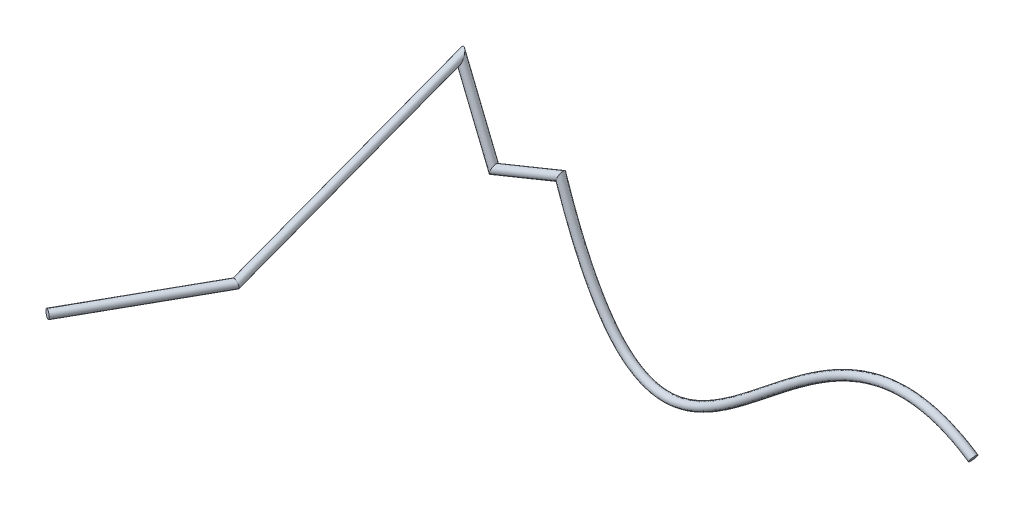
ISO-10303-21;
HEADER;
FILE_DESCRIPTION(('STEP AP214'),'2;1');
FILE_NAME('part.step','',(''),(''),'','','');
FILE_SCHEMA(('AUTOMOTIVE_DESIGN { 1 0 10303 214 1 1 1 1 }'));
ENDSEC;
DATA;
#1=APPLICATION_CONTEXT('core data for automotive mechanical design processes');
#2=APPLICATION_PROTOCOL_DEFINITION('international standard','automotive_design',2000,#1);
#3=PRODUCT_CONTEXT('',#1,'mechanical');
#4=PRODUCT('Part','Part','',(#3));
#5=PRODUCT_RELATED_PRODUCT_CATEGORY('part','',(#4));
#6=PRODUCT_DEFINITION_FORMATION('','',#4);
#7=PRODUCT_DEFINITION_CONTEXT('part definition',#1,'design');
#8=PRODUCT_DEFINITION('design','',#6,#7);
#9=PRODUCT_DEFINITION_SHAPE('','',#8);
#10=(LENGTH_UNIT() NAMED_UNIT(*) SI_UNIT(.MILLI.,.METRE.));
#11=(NAMED_UNIT(*) PLANE_ANGLE_UNIT() SI_UNIT($,.RADIAN.));
#12=(NAMED_UNIT(*) SI_UNIT($,.STERADIAN.) SOLID_ANGLE_UNIT());
#13=UNCERTAINTY_MEASURE_WITH_UNIT(LENGTH_MEASURE(1.E-05),#10,'distance_accuracy_value','');
#14=(GEOMETRIC_REPRESENTATION_CONTEXT(3) GLOBAL_UNCERTAINTY_ASSIGNED_CONTEXT((#13)) GLOBAL_UNIT_ASSIGNED_CONTEXT((#10,
#11,#12)) REPRESENTATION_CONTEXT('',''));
#15=CARTESIAN_POINT('',(0.,0.,0.));
#16=DIRECTION('',(0.,0.,1.));
#17=DIRECTION('',(1.,0.,0.));
#18=AXIS2_PLACEMENT_3D('',#15,#16,#17);
#19=CARTESIAN_POINT('',(497.216779831888,-46.1851285831756,-1.13686837721616E-10));
#20=DIRECTION('',(-0.829798156967304,0.55806363319398,1.88543639242115E-13));
#21=DIRECTION('',(-0.55806363319398,-0.829798156967304,0.));
#22=AXIS2_PLACEMENT_3D('',#19,#20,#21);
#23=PLANE('',#22);
#24=CARTESIAN_POINT('',(497.216779831888,-46.1851285831756,-1.13686837721616E-10));
#25=DIRECTION('',(-0.829798156967304,0.55806363319398,1.88543639242115E-13));
#26=DIRECTION('',(-0.55806363319398,-0.829798156967304,0.));
#27=AXIS2_PLACEMENT_3D('',#24,#25,#26);
#28=CIRCLE('',#27,5.);
#29=CARTESIAN_POINT('',(494.426461665918,-50.3341193680121,-1.13686837721616E-10));
#30=VERTEX_POINT('',#29);
#31=EDGE_CURVE('E54',#30,#30,#28,.T.);
#32=ORIENTED_EDGE('',*,*,#31,.F.);
#33=EDGE_LOOP('',(#32));
#34=FACE_BOUND('',#33,.T.);
#35=ADVANCED_FACE('F51',(#34),#23,.F.);
#36=CARTESIAN_POINT('',(-202.256735264331,-36.9063998138871,416.452245622386));
#37=DIRECTION('',(-0.489709501015613,0.,0.87188566028754));
#38=DIRECTION('',(-0.782575842068746,-0.44087797243746,-0.439547113322142));
#39=AXIS2_PLACEMENT_3D('',#36,#37,#38);
#40=PLANE('',#39);
#41=CARTESIAN_POINT('',(-202.256735264331,-36.9063998138871,416.452245622386));
#42=DIRECTION('',(-0.489709501015613,0.,0.87188566028754));
#43=DIRECTION('',(-0.782575842068746,-0.44087797243746,-0.439547113322142));
#44=AXIS2_PLACEMENT_3D('',#41,#42,#43);
#45=CIRCLE('',#44,5.);
#46=CARTESIAN_POINT('',(-206.169614474675,-39.1107896760744,414.254510055775));
#47=VERTEX_POINT('',#46);
#48=EDGE_CURVE('E59',#47,#47,#45,.T.);
#49=ORIENTED_EDGE('',*,*,#48,.T.);
#50=EDGE_LOOP('',(#49));
#51=FACE_BOUND('',#50,.T.);
#52=ADVANCED_FACE('F103',(#51),#40,.T.);
#53=CARTESIAN_POINT('',(-6.63474122880986,4.0650512970628,-8.80261898284409E-13));
#54=CARTESIAN_POINT('',(-6.0035207391564,2.1806569216738,-6.37784321443613E-13));
#55=CARTESIAN_POINT('',(-5.37388169208276,0.300982080219251,-3.95913953218129E-13));
#56=CARTESIAN_POINT('',(-2.54033983180936,-8.1580365667172,6.9256394216942E-13));
#57=CARTESIAN_POINT('',(-0.328969705829117,-14.5324954036041,1.50050494951648E-12));
#58=CARTESIAN_POINT('',(4.08312919821201,-26.8046610107858,3.03062382439137E-12));
#59=CARTESIAN_POINT('',(6.28935711963189,-32.7187923428632,3.75491557554203E-12));
#60=CARTESIAN_POINT('',(12.9103724025411,-49.8144184352364,5.80820924468679E-12));
#61=CARTESIAN_POINT('',(17.327410592961,-60.3491361879649,7.01764095717164E-12));
#62=CARTESIAN_POINT('',(30.6043976298377,-89.5193964643671,1.01891184635107E-11));
#63=CARTESIAN_POINT('',(39.4880050848905,-105.722114577973,1.16948999032293E-11));
#64=CARTESIAN_POINT('',(57.4502543438682,-132.448194600693,1.35958017822525E-11));
#65=CARTESIAN_POINT('',(66.5315598473905,-142.977430395832,1.39915655149074E-11));
#66=CARTESIAN_POINT('',(85.0724108261196,-159.068797156933,1.37526507977899E-11));
#67=CARTESIAN_POINT('',(94.5491713236075,-164.62554381891,1.31142048198872E-11));
#68=CARTESIAN_POINT('',(113.834005288215,-171.262487594358,1.08837615934277E-11));
#69=CARTESIAN_POINT('',(123.616351955995,-172.323346833214,9.29238797402864E-12));
#70=CARTESIAN_POINT('',(143.11619774965,-170.777656736841,5.34768741321133E-12));
#71=CARTESIAN_POINT('',(152.831916525129,-168.194028030498,2.99883889543333E-12));
#72=CARTESIAN_POINT('',(181.936513959763,-156.509771788991,-4.94342656092221E-12));
#73=CARTESIAN_POINT('',(201.347233479159,-143.50008080194,-1.14385307465792E-11));
#74=CARTESIAN_POINT('',(241.158752519339,-113.538596838648,-2.59618388880978E-11));
#75=CARTESIAN_POINT('',(261.546287493366,-96.5582198062982,-3.39931244441428E-11));
#76=CARTESIAN_POINT('',(303.699242799623,-64.85447344232,-5.0681176746404E-11));
#77=CARTESIAN_POINT('',(325.459824610901,-50.1425259263933,-5.93350730027813E-11));
#78=CARTESIAN_POINT('',(359.222014105486,-34.4010459149647,-7.20743644230787E-11));
#79=CARTESIAN_POINT('',(370.65948906735,-30.2059742037353,-7.62803982912943E-11));
#80=CARTESIAN_POINT('',(393.935607225174,-24.6356125891442,-8.45067748175605E-11));
#81=CARTESIAN_POINT('',(405.772194632465,-23.2571386520997,-8.85273672604397E-11));
#82=CARTESIAN_POINT('',(429.974273693256,-24.0214678962733,-9.62956410229051E-11));
#83=CARTESIAN_POINT('',(442.345003664112,-26.1614253752944,-1.00044689488908E-10));
#84=CARTESIAN_POINT('',(467.813759466925,-34.7718574761453,-1.07174379042913E-10));
#85=CARTESIAN_POINT('',(480.914734209081,-41.2470857924265,-1.10554627751355E-10));
#86=CARTESIAN_POINT('',(494.426461665918,-50.3341193680121,-1.13686837721616E-10));
#87=CARTESIAN_POINT('',(-6.63474122881053,4.06505129706386,9.99999999999912));
#88=CARTESIAN_POINT('',(-6.00352073915707,2.18065692167485,9.99999999999936));
#89=CARTESIAN_POINT('',(-5.37388169205585,0.300982080220305,9.9999999999996));
#90=CARTESIAN_POINT('',(-2.54033983190595,-8.15803656671615,10.0000000000007));
#91=CARTESIAN_POINT('',(-0.328969705829783,-14.5324954036032,10.0000000000015));
#92=CARTESIAN_POINT('',(4.08312919821134,-26.8046610107849,10.000000000003));
#93=CARTESIAN_POINT('',(6.28935711954707,-32.7187923428622,10.0000000000038));
#94=CARTESIAN_POINT('',(12.9103724027089,-49.8144184352355,10.0000000000058));
#95=CARTESIAN_POINT('',(17.3274105929604,-60.3491361878173,10.000000000007));
#96=CARTESIAN_POINT('',(30.604397629837,-89.5193964646598,10.0000000000102));
#97=CARTESIAN_POINT('',(39.4880050848901,-105.722114577864,10.0000000000117));
#98=CARTESIAN_POINT('',(57.4502543438678,-132.448194600802,10.0000000000136));
#99=CARTESIAN_POINT('',(66.5315598475533,-142.97743039575,10.000000000014));
#100=CARTESIAN_POINT('',(85.0724108259569,-159.068797157014,10.0000000000138));
#101=CARTESIAN_POINT('',(94.5491713236085,-164.62554381891,10.0000000000131));
#102=CARTESIAN_POINT('',(113.834005288216,-171.262487594359,10.0000000000109));
#103=CARTESIAN_POINT('',(123.616351956124,-172.323346833214,10.0000000000093));
#104=CARTESIAN_POINT('',(143.116197749525,-170.777656736842,10.0000000000053));
#105=CARTESIAN_POINT('',(152.831916525132,-168.194028030498,10.000000000003));
#106=CARTESIAN_POINT('',(181.936513959765,-156.509771788991,9.99999999999506));
#107=CARTESIAN_POINT('',(201.347233479163,-143.50008080194,9.99999999998856));
#108=CARTESIAN_POINT('',(241.158752519342,-113.538596838648,9.99999999997404));
#109=CARTESIAN_POINT('',(261.54628749337,-96.5582198062978,9.999999999966));
#110=CARTESIAN_POINT('',(303.699242799627,-64.8544734423196,9.99999999994932));
#111=CARTESIAN_POINT('',(325.459824611609,-50.1425259260408,9.99999999994066));
#112=CARTESIAN_POINT('',(359.222014105138,-34.4010459151407,9.99999999992792));
#113=CARTESIAN_POINT('',(370.659489067354,-30.205974203564,9.99999999992372));
#114=CARTESIAN_POINT('',(393.935607225178,-24.6356125893161,9.99999999991549));
#115=CARTESIAN_POINT('',(405.772194632643,-23.2571386522751,9.99999999991147));
#116=CARTESIAN_POINT('',(429.974273693084,-24.0214678960992,9.9999999999037));
#117=CARTESIAN_POINT('',(442.345003664308,-26.1614253753921,9.99999999989995));
#118=CARTESIAN_POINT('',(467.813759466735,-34.7718574760497,9.99999999989282));
#119=CARTESIAN_POINT('',(480.914734209083,-41.2470857924275,9.99999999988944));
#120=CARTESIAN_POINT('',(494.42646166592,-50.3341193680132,9.99999999988631));
#121=CARTESIAN_POINT('',(2.84741829145801,7.24131495617358,9.99999999999942));
#122=CARTESIAN_POINT('',(3.47863878111148,5.35692058078458,9.99999999999967));
#123=CARTESIAN_POINT('',(4.1114407306189,3.46780348298858,9.99999999999991));
#124=CARTESIAN_POINT('',(6.93081983949474,-4.94893490649584,10.000000000001));
#125=CARTESIAN_POINT('',(9.10737386974061,-11.2217038102921,10.0000000000018));
#126=CARTESIAN_POINT('',(13.4674063906256,-23.3490478048166,10.0000000000033));
#127=CARTESIAN_POINT('',(15.6453857972625,-29.1872094181049,10.000000000004));
#128=CARTESIAN_POINT('',(22.1735101240072,-46.0429887492,10.000000000006));
#129=CARTESIAN_POINT('',(26.5179218349865,-56.4019100641805,10.0000000000072));
#130=CARTESIAN_POINT('',(39.5280971671941,-84.9859705610356,10.0000000000103));
#131=CARTESIAN_POINT('',(48.1730148413312,-100.717337717054,10.0000000000118));
#132=CARTESIAN_POINT('',(65.3646078806035,-126.296756231475,10.0000000000136));
#133=CARTESIAN_POINT('',(73.9086195392337,-136.138933702178,10.000000000014));
#134=CARTESIAN_POINT('',(90.8044865217231,-150.802639952083,10.0000000000137));
#135=CARTESIAN_POINT('',(99.1391268202903,-155.629553031721,10.0000000000131));
#136=CARTESIAN_POINT('',(115.752469676066,-161.347093699123,10.0000000000112));
#137=CARTESIAN_POINT('',(124.056899034692,-162.257059160433,10.0000000000098));
#138=CARTESIAN_POINT('',(141.095272119733,-160.906482092797,10.0000000000063));
#139=CARTESIAN_POINT('',(149.83099619763,-158.623018938836,10.0000000000042));
#140=CARTESIAN_POINT('',(176.76166496229,-147.811502466397,9.99999999999672));
#141=CARTESIAN_POINT('',(195.615706427142,-135.298015485465,9.99999999999041));
#142=CARTESIAN_POINT('',(234.863875841583,-105.760499035545,9.99999999997605));
#143=CARTESIAN_POINT('',(255.271268340146,-88.7650536210719,9.99999999996801));
#144=CARTESIAN_POINT('',(297.9526672475,-56.6638584497299,9.99999999995117));
#145=CARTESIAN_POINT('',(320.231512180075,-41.546686887325,9.99999999994236));
#146=CARTESIAN_POINT('',(355.497586842433,-25.1040266892726,9.99999999992925));
#147=CARTESIAN_POINT('',(367.564387276079,-20.6643080636778,9.99999999992489));
#148=CARTESIAN_POINT('',(392.375819509933,-14.7265202945784,9.99999999991635));
#149=CARTESIAN_POINT('',(405.122507111061,-13.2316351803878,9.99999999991216));
#150=CARTESIAN_POINT('',(431.255269268092,-14.0569375975879,9.99999999990409));
#151=CARTESIAN_POINT('',(444.636105511404,-16.3799708330113,9.99999999990021));
#152=CARTESIAN_POINT('',(471.928064949359,-25.6067884074782,9.9999999998929));
#153=CARTESIAN_POINT('',(485.836239217588,-32.5058190478055,9.99999999988947));
#154=CARTESIAN_POINT('',(500.007097997859,-42.0361377983401,9.99999999988631));
#155=CARTESIAN_POINT('',(2.84741829145868,7.24131495617253,-5.73991239289506E-13));
#156=CARTESIAN_POINT('',(3.47863878111214,5.35692058078352,-3.3151366244871E-13));
#157=CARTESIAN_POINT('',(4.11144073059198,3.46780348298753,0.));
#158=CARTESIAN_POINT('',(6.93081983959132,-4.94893490649689,9.94609119766119E-13));
#159=CARTESIAN_POINT('',(9.10737386983123,-11.2217038102931,1.78958670198373E-12));
#160=CARTESIAN_POINT('',(13.4674063905363,-23.3490478048176,3.30164516135736E-12));
#161=CARTESIAN_POINT('',(15.6453857973473,-29.1872094181059,4.01661417161379E-12));
#162=CARTESIAN_POINT('',(22.1735101238394,-46.042988749201,6.04107390459588E-12));
#163=CARTESIAN_POINT('',(26.5179218349871,-56.4019100641813,7.23010594808984E-12));
#164=CARTESIAN_POINT('',(39.5280971671948,-84.9859705610365,1.03375428410859E-11));
#165=CARTESIAN_POINT('',(48.1730148411129,-100.717337717054,1.17957351734387E-11));
#166=CARTESIAN_POINT('',(65.3646078808225,-126.296756231476,1.36115820558223E-11));
#167=CARTESIAN_POINT('',(73.9086195390708,-136.138933702178,1.39685933120266E-11));
#168=CARTESIAN_POINT('',(90.8044865218858,-150.802639952083,1.37345987621389E-11));
#169=CARTESIAN_POINT('',(99.1391268202893,-155.629553031655,1.31473604833863E-11));
#170=CARTESIAN_POINT('',(115.752469676065,-161.347093699189,1.11807154891467E-11));
#171=CARTESIAN_POINT('',(124.056899034817,-162.257059160179,9.80068514433042E-12));
#172=CARTESIAN_POINT('',(141.095272119604,-160.906482093051,6.28959760620244E-12));
#173=CARTESIAN_POINT('',(149.830996197767,-158.623018938976,4.1540619894828E-12));
#174=CARTESIAN_POINT('',(176.761664962007,-147.811502466118,-3.27718590584145E-12));
#175=CARTESIAN_POINT('',(195.615706427482,-135.298015485122,-9.59157188666972E-12));
#176=CARTESIAN_POINT('',(234.863875841236,-105.760499035888,-2.39462903067198E-11));
#177=CARTESIAN_POINT('',(255.271268340142,-88.7650536214405,-3.19835411465299E-11));
#178=CARTESIAN_POINT('',(297.952667247496,-56.663858449362,-4.88296915588146E-11));
#179=CARTESIAN_POINT('',(320.231512180072,-41.5466868869728,-5.76414616257558E-11));
#180=CARTESIAN_POINT('',(355.497586842429,-25.1040266894489,-7.07520799072761E-11));
#181=CARTESIAN_POINT('',(367.564387276075,-20.6643080636776,-7.51045843104856E-11));
#182=CARTESIAN_POINT('',(392.375819509929,-14.7265202945782,-8.36463481926918E-11));
#183=CARTESIAN_POINT('',(405.122507111058,-13.2316351802998,-8.78353578890872E-11));
#184=CARTESIAN_POINT('',(431.255269268089,-14.0569375976746,-9.59046127378561E-11));
#185=CARTESIAN_POINT('',(444.636105511401,-16.3799708330103,-9.97834907410252E-11));
#186=CARTESIAN_POINT('',(471.928064949356,-25.6067884074772,-1.0709523892201E-10));
#187=CARTESIAN_POINT('',(485.836239217587,-32.5058190478044,-1.10528501477151E-10));
#188=CARTESIAN_POINT('',(500.007097997858,-42.0361377983391,-1.13686225398216E-10));
#189=CARTESIAN_POINT('',(2.84741829145935,7.24131495617147,-10.0000000000006));
#190=CARTESIAN_POINT('',(3.47863878111281,5.35692058078247,-10.0000000000003));
#191=CARTESIAN_POINT('',(4.11144073056507,3.46780348298647,-10.0000000000001));
#192=CARTESIAN_POINT('',(6.9308198396879,-4.94893490649795,-9.999999999999));
#193=CARTESIAN_POINT('',(9.1073738699218,-11.2217038102941,-9.99999999999821));
#194=CARTESIAN_POINT('',(13.4674063904469,-23.3490478048186,-9.9999999999967));
#195=CARTESIAN_POINT('',(15.6453857974322,-29.1872094181068,-9.99999999999598));
#196=CARTESIAN_POINT('',(22.1735101236716,-46.0429887492019,-9.99999999999396));
#197=CARTESIAN_POINT('',(26.5179218349877,-56.4019100641822,-9.99999999999277));
#198=CARTESIAN_POINT('',(39.5280971671954,-84.9859705610374,-9.99999999998966));
#199=CARTESIAN_POINT('',(48.1730148408947,-100.717337717055,-9.9999999999882));
#200=CARTESIAN_POINT('',(65.3646078810416,-126.296756231476,-9.99999999998639));
#201=CARTESIAN_POINT('',(73.9086195389079,-136.138933702178,-9.99999999998603));
#202=CARTESIAN_POINT('',(90.8044865220485,-150.802639952083,-9.99999999998626));
#203=CARTESIAN_POINT('',(99.1391268202883,-155.629553031588,-9.99999999998685));
#204=CARTESIAN_POINT('',(115.752469676064,-161.347093699254,-9.99999999998882));
#205=CARTESIAN_POINT('',(124.056899034943,-162.257059159924,-9.9999999999902));
#206=CARTESIAN_POINT('',(141.095272119475,-160.906482093305,-9.99999999999371));
#207=CARTESIAN_POINT('',(149.830996197903,-158.623018939115,-9.99999999999584));
#208=CARTESIAN_POINT('',(176.761664961725,-147.811502465838,-10.0000000000033));
#209=CARTESIAN_POINT('',(195.615706427822,-135.298015484779,-10.0000000000096));
#210=CARTESIAN_POINT('',(234.863875840889,-105.760499036232,-10.0000000000239));
#211=CARTESIAN_POINT('',(255.271268340139,-88.7650536218091,-10.000000000032));
#212=CARTESIAN_POINT('',(297.952667247492,-56.663858448994,-10.0000000000488));
#213=CARTESIAN_POINT('',(320.231512180068,-41.5466868866206,-10.0000000000576));
#214=CARTESIAN_POINT('',(355.497586842426,-25.1040266896252,-10.0000000000708));
#215=CARTESIAN_POINT('',(367.564387276072,-20.6643080636773,-10.0000000000751));
#216=CARTESIAN_POINT('',(392.375819509925,-14.7265202945779,-10.0000000000836));
#217=CARTESIAN_POINT('',(405.122507111055,-13.2316351802117,-10.0000000000878));
#218=CARTESIAN_POINT('',(431.255269268086,-14.0569375977613,-10.0000000000959));
#219=CARTESIAN_POINT('',(444.636105511399,-16.3799708330093,-10.0000000000998));
#220=CARTESIAN_POINT('',(471.928064949354,-25.6067884074762,-10.0000000001071));
#221=CARTESIAN_POINT('',(485.836239217585,-32.5058190478033,-10.0000000001105));
#222=CARTESIAN_POINT('',(500.007097997856,-42.036137798338,-10.0000000001137));
#223=CARTESIAN_POINT('',(-6.63474122880919,4.06505129706175,-10.0000000000009));
#224=CARTESIAN_POINT('',(-6.00352073915573,2.18065692167274,-10.0000000000006));
#225=CARTESIAN_POINT('',(-5.37388169210967,0.300982080218196,-10.0000000000004));
#226=CARTESIAN_POINT('',(-2.54033983171278,-8.15803656671825,-9.99999999999931));
#227=CARTESIAN_POINT('',(-0.328969705828451,-14.5324954036051,-9.9999999999985));
#228=CARTESIAN_POINT('',(4.08312919821267,-26.8046610107869,-9.99999999999697));
#229=CARTESIAN_POINT('',(6.28935711971677,-32.7187923428641,-9.99999999999624));
#230=CARTESIAN_POINT('',(12.9103724023733,-49.8144184352374,-9.99999999999419));
#231=CARTESIAN_POINT('',(17.3274105929616,-60.3491361881126,-9.99999999999298));
#232=CARTESIAN_POINT('',(30.6043976298383,-89.5193964640745,-9.99999999998981));
#233=CARTESIAN_POINT('',(39.4880050848909,-105.722114578083,-9.9999999999883));
#234=CARTESIAN_POINT('',(57.4502543438685,-132.448194600584,-9.9999999999864));
#235=CARTESIAN_POINT('',(66.5315598472276,-142.977430395913,-9.99999999998601));
#236=CARTESIAN_POINT('',(85.0724108262823,-159.068797156852,-9.99999999998625));
#237=CARTESIAN_POINT('',(94.5491713236065,-164.625543818909,-9.99999999998688));
#238=CARTESIAN_POINT('',(113.834005288214,-171.262487594358,-9.99999999998911));
#239=CARTESIAN_POINT('',(123.616351955865,-172.323346833213,-9.99999999999071));
#240=CARTESIAN_POINT('',(143.116197749775,-170.77765673684,-9.99999999999465));
#241=CARTESIAN_POINT('',(152.831916525126,-168.194028030498,-9.999999999997));
#242=CARTESIAN_POINT('',(181.93651395976,-156.509771788991,-10.0000000000049));
#243=CARTESIAN_POINT('',(201.347233479156,-143.500080801941,-10.0000000000114));
#244=CARTESIAN_POINT('',(241.158752519335,-113.538596838648,-10.000000000026));
#245=CARTESIAN_POINT('',(261.546287493362,-96.5582198062986,-10.000000000034));
#246=CARTESIAN_POINT('',(303.699242799619,-64.8544734423203,-10.0000000000507));
#247=CARTESIAN_POINT('',(325.459824610193,-50.1425259267457,-10.0000000000593));
#248=CARTESIAN_POINT('',(359.222014105835,-34.4010459147886,-10.0000000000721));
#249=CARTESIAN_POINT('',(370.659489067347,-30.2059742039066,-10.0000000000763));
#250=CARTESIAN_POINT('',(393.935607225171,-24.6356125889725,-10.0000000000845));
#251=CARTESIAN_POINT('',(405.772194632288,-23.2571386519244,-10.0000000000885));
#252=CARTESIAN_POINT('',(429.974273693427,-24.0214678964474,-10.0000000000963));
#253=CARTESIAN_POINT('',(442.345003663917,-26.1614253751969,-10.0000000001));
#254=CARTESIAN_POINT('',(467.813759467116,-34.771857476241,-10.0000000001072));
#255=CARTESIAN_POINT('',(480.91473420908,-41.2470857924254,-10.0000000001106));
#256=CARTESIAN_POINT('',(494.426461665916,-50.3341193680111,-10.0000000001137));
#257=CARTESIAN_POINT('',(-6.63474122880986,4.0650512970628,-8.80261898284409E-13));
#258=CARTESIAN_POINT('',(-6.0035207391564,2.1806569216738,-6.37784321443613E-13));
#259=CARTESIAN_POINT('',(-5.37388169208276,0.300982080219251,-3.95913953218129E-13));
#260=CARTESIAN_POINT('',(-2.54033983180936,-8.1580365667172,6.9256394216942E-13));
#261=CARTESIAN_POINT('',(-0.328969705829117,-14.5324954036041,1.50050494951648E-12));
#262=CARTESIAN_POINT('',(4.08312919821201,-26.8046610107858,3.03062382439137E-12));
#263=CARTESIAN_POINT('',(6.28935711963189,-32.7187923428632,3.75491557554203E-12));
#264=CARTESIAN_POINT('',(12.9103724025411,-49.8144184352364,5.80820924468679E-12));
#265=CARTESIAN_POINT('',(17.327410592961,-60.3491361879649,7.01764095717164E-12));
#266=CARTESIAN_POINT('',(30.6043976298377,-89.5193964643671,1.01891184635107E-11));
#267=CARTESIAN_POINT('',(39.4880050848905,-105.722114577973,1.16948999032293E-11));
#268=CARTESIAN_POINT('',(57.4502543438682,-132.448194600693,1.35958017822525E-11));
#269=CARTESIAN_POINT('',(66.5315598473905,-142.977430395832,1.39915655149074E-11));
#270=CARTESIAN_POINT('',(85.0724108261196,-159.068797156933,1.37526507977899E-11));
#271=CARTESIAN_POINT('',(94.5491713236075,-164.62554381891,1.31142048198872E-11));
#272=CARTESIAN_POINT('',(113.834005288215,-171.262487594358,1.08837615934277E-11));
#273=CARTESIAN_POINT('',(123.616351955995,-172.323346833214,9.29238797402864E-12));
#274=CARTESIAN_POINT('',(143.11619774965,-170.777656736841,5.34768741321133E-12));
#275=CARTESIAN_POINT('',(152.831916525129,-168.194028030498,2.99883889543333E-12));
#276=CARTESIAN_POINT('',(181.936513959763,-156.509771788991,-4.94342656092221E-12));
#277=CARTESIAN_POINT('',(201.347233479159,-143.50008080194,-1.14385307465792E-11));
#278=CARTESIAN_POINT('',(241.158752519339,-113.538596838648,-2.59618388880978E-11));
#279=CARTESIAN_POINT('',(261.546287493366,-96.5582198062982,-3.39931244441428E-11));
#280=CARTESIAN_POINT('',(303.699242799623,-64.85447344232,-5.0681176746404E-11));
#281=CARTESIAN_POINT('',(325.459824610901,-50.1425259263933,-5.93350730027813E-11));
#282=CARTESIAN_POINT('',(359.222014105486,-34.4010459149647,-7.20743644230787E-11));
#283=CARTESIAN_POINT('',(370.65948906735,-30.2059742037353,-7.62803982912943E-11));
#284=CARTESIAN_POINT('',(393.935607225174,-24.6356125891442,-8.45067748175605E-11));
#285=CARTESIAN_POINT('',(405.772194632465,-23.2571386520997,-8.85273672604397E-11));
#286=CARTESIAN_POINT('',(429.974273693256,-24.0214678962733,-9.62956410229051E-11));
#287=CARTESIAN_POINT('',(442.345003664112,-26.1614253752944,-1.00044689488908E-10));
#288=CARTESIAN_POINT('',(467.813759466925,-34.7718574761453,-1.07174379042913E-10));
#289=CARTESIAN_POINT('',(480.914734209081,-41.2470857924265,-1.10554627751355E-10));
#290=CARTESIAN_POINT('',(494.426461665918,-50.3341193680121,-1.13686837721616E-10));
#291=(BOUNDED_SURFACE() B_SPLINE_SURFACE(3,3,((#53,#54,#55,#56,#57,#58,#59,#60,#61,#62,#63,#64,
#65,#66,#67,#68,#69,#70,#71,#72,#73,#74,#75,#76,#77,#78,#79,#80,#81,#82,#83,#84,#85,#86),(#87,
#88,#89,#90,#91,#92,#93,#94,#95,#96,#97,#98,#99,#100,#101,#102,#103,#104,#105,#106,#107,#108,
#109,#110,#111,#112,#113,#114,#115,#116,#117,#118,#119,#120),(#121,#122,#123,#124,#125,#126,
#127,#128,#129,#130,#131,#132,#133,#134,#135,#136,#137,#138,#139,#140,#141,#142,#143,#144,#145,
#146,#147,#148,#149,#150,#151,#152,#153,#154),(#155,#156,#157,#158,#159,#160,#161,#162,#163,
#164,#165,#166,#167,#168,#169,#170,#171,#172,#173,#174,#175,#176,#177,#178,#179,#180,#181,#182,
#183,#184,#185,#186,#187,#188),(#189,#190,#191,#192,#193,#194,#195,#196,#197,#198,#199,#200,
#201,#202,#203,#204,#205,#206,#207,#208,#209,#210,#211,#212,#213,#214,#215,#216,#217,#218,#219,
#220,#221,#222),(#223,#224,#225,#226,#227,#228,#229,#230,#231,#232,#233,#234,#235,#236,#237,
#238,#239,#240,#241,#242,#243,#244,#245,#246,#247,#248,#249,#250,#251,#252,#253,#254,#255,#256),
(#257,#258,#259,#260,#261,#262,#263,#264,#265,#266,#267,#268,#269,#270,#271,#272,#273,#274,#275,
#276,#277,#278,#279,#280,#281,#282,#283,#284,#285,#286,#287,#288,#289,#290)),.UNSPECIFIED.,.T.,
.F.,.F.) B_SPLINE_SURFACE_WITH_KNOTS((4,3,4),(4,2,2,2,2,2,2,2,2,2,2,2,2,2,2,2,4),(0.,0.5,1.),
(-0.00449282082786631,0.,0.015625,0.03125,0.0625,0.125,0.1875,0.25,0.3125,0.375,0.5,0.625,0.75,
0.8125,0.875,0.9375,1.),
.UNSPECIFIED.) GEOMETRIC_REPRESENTATION_ITEM() RATIONAL_B_SPLINE_SURFACE(((1.,1.,1.,1.,1.,1.,1.,
1.,1.,1.,1.,1.,1.,1.,1.,1.,1.,1.,1.,1.,1.,1.,1.,1.,1.,1.,1.,1.,1.,1.,1.,1.,1.,1.),
(0.333333333333333,0.333333333333333,0.333333333333333,0.333333333333333,0.333333333333333,
0.333333333333333,0.333333333333333,0.333333333333333,0.333333333333333,0.333333333333333,
0.333333333333333,0.333333333333333,0.333333333333333,0.333333333333333,0.333333333333333,
0.333333333333333,0.333333333333333,0.333333333333333,0.333333333333333,0.333333333333333,
0.333333333333333,0.333333333333333,0.333333333333333,0.333333333333333,0.333333333333333,
0.333333333333333,0.333333333333333,0.333333333333333,0.333333333333333,0.333333333333333,
0.333333333333333,0.333333333333333,0.333333333333333,0.333333333333333),(0.333333333333333,
0.333333333333333,0.333333333333333,0.333333333333333,0.333333333333333,0.333333333333333,
0.333333333333333,0.333333333333333,0.333333333333333,0.333333333333333,0.333333333333333,
0.333333333333333,0.333333333333333,0.333333333333333,0.333333333333333,0.333333333333333,
0.333333333333333,0.333333333333333,0.333333333333333,0.333333333333333,0.333333333333333,
0.333333333333333,0.333333333333333,0.333333333333333,0.333333333333333,0.333333333333333,
0.333333333333333,0.333333333333333,0.333333333333333,0.333333333333333,0.333333333333333,
0.333333333333333,0.333333333333333,0.333333333333333),(1.,1.,1.,1.,1.,1.,1.,1.,1.,1.,1.,1.,1.,
1.,1.,1.,1.,1.,1.,1.,1.,1.,1.,1.,1.,1.,1.,1.,1.,1.,1.,1.,1.,1.),(0.333333333333333,
0.333333333333333,0.333333333333333,0.333333333333333,0.333333333333333,0.333333333333333,
0.333333333333333,0.333333333333333,0.333333333333333,0.333333333333333,0.333333333333333,
0.333333333333333,0.333333333333333,0.333333333333333,0.333333333333333,0.333333333333333,
0.333333333333333,0.333333333333333,0.333333333333333,0.333333333333333,0.333333333333333,
0.333333333333333,0.333333333333333,0.333333333333333,0.333333333333333,0.333333333333333,
0.333333333333333,0.333333333333333,0.333333333333333,0.333333333333333,0.333333333333333,
0.333333333333333,0.333333333333333,0.333333333333333),(0.333333333333333,0.333333333333333,
0.333333333333333,0.333333333333333,0.333333333333333,0.333333333333333,0.333333333333333,
0.333333333333333,0.333333333333333,0.333333333333333,0.333333333333333,0.333333333333333,
0.333333333333333,0.333333333333333,0.333333333333333,0.333333333333333,0.333333333333333,
0.333333333333333,0.333333333333333,0.333333333333333,0.333333333333333,0.333333333333333,
0.333333333333333,0.333333333333333,0.333333333333333,0.333333333333333,0.333333333333333,
0.333333333333333,0.333333333333333,0.333333333333333,0.333333333333333,0.333333333333333,
0.333333333333333,0.333333333333333),(1.,1.,1.,1.,1.,1.,1.,1.,1.,1.,1.,1.,1.,1.,1.,1.,1.,1.,1.,
1.,1.,1.,1.,1.,1.,1.,1.,1.,1.,1.,1.,1.,1.,1.))) REPRESENTATION_ITEM('') SURFACE());
#292=CARTESIAN_POINT('',(-2.12666557683791E-13,4.66522900653531E-13,5.));
#293=CARTESIAN_POINT('',(0.00196854431543346,0.00428857305048585,4.99999999752717));
#294=CARTESIAN_POINT('',(0.00393710422082396,0.00857718005861927,4.99999687012811));
#295=CARTESIAN_POINT('',(0.126963308192589,0.276595968050684,4.99960610459238));
#296=CARTESIAN_POINT('',(0.248072104554197,0.540437568302159,4.98740265914614));
#297=CARTESIAN_POINT('',(0.489533533123124,1.06647339626396,4.93914594233489));
#298=CARTESIAN_POINT('',(0.609885459656116,1.3286660866018,4.90307301789669));
#299=CARTESIAN_POINT('',(0.849134230132488,1.84988147263035,4.80636980701459));
#300=CARTESIAN_POINT('',(0.9680277599279,2.10889694823603,4.74569152871933));
#301=CARTESIAN_POINT('',(1.20294971728971,2.62068611352512,4.59886466367869));
#302=CARTESIAN_POINT('',(1.31897994721644,2.8734637297519,4.51273256663211));
#303=CARTESIAN_POINT('',(1.58280039502531,3.44820965898967,4.28227151087009));
#304=CARTESIAN_POINT('',(1.72916772292917,3.76707813125524,4.12816558735962));
#305=CARTESIAN_POINT('',(1.94014378138244,4.22669991637081,3.85939601550439));
#306=CARTESIAN_POINT('',(2.00899879397918,4.37670396805804,3.76361075966578));
#307=CARTESIAN_POINT('',(2.1432055921954,4.6690801171975,3.55888278429709));
#308=CARTESIAN_POINT('',(2.20855841998138,4.81145448506132,3.44994401068452));
#309=CARTESIAN_POINT('',(2.36467672760019,5.15156594032292,3.16378151819887));
#310=CARTESIAN_POINT('',(2.45294059266617,5.34385313624709,2.97853709318595));
#311=CARTESIAN_POINT('',(2.61637992430765,5.69991380655798,2.57730569452994));
#312=CARTESIAN_POINT('',(2.69157062567829,5.86372047069714,2.36135504536818));
#313=CARTESIAN_POINT('',(2.80976882555945,6.12122110075312,1.94969285252464));
#314=CARTESIAN_POINT('',(2.85621953666851,6.22241627529597,1.75973910472153));
#315=CARTESIAN_POINT('',(2.91566870276732,6.35192922846717,1.46327600723894));
#316=CARTESIAN_POINT('',(2.93377611501416,6.39137712313871,1.36256968857663));
#317=CARTESIAN_POINT('',(2.96629168273919,6.4622138985182,1.15779313268611));
#318=CARTESIAN_POINT('',(2.98070069939808,6.49360465535093,1.05372368493712));
#319=CARTESIAN_POINT('',(3.01125447241681,6.56016756409723,0.794250150648727));
#320=CARTESIAN_POINT('',(3.02514237944276,6.59042305795698,0.63727768586614));
#321=CARTESIAN_POINT('',(3.04373620667183,6.6309306322825,0.320181694524928));
#322=CARTESIAN_POINT('',(3.0484412360995,6.6411807721498,0.160057863792963));
#323=CARTESIAN_POINT('',(3.04844663706836,6.64119253843027,-0.109390602712304));
#324=CARTESIAN_POINT('',(3.0462526286644,6.63641278235229,-0.218750392541676));
#325=CARTESIAN_POINT('',(3.03753315916625,6.61741698580161,-0.436510751541089));
#326=CARTESIAN_POINT('',(3.03100667080576,6.60319870737837,-0.544911087038187));
#327=CARTESIAN_POINT('',(3.01376274422931,6.56563195859642,-0.759849167227761));
#328=CARTESIAN_POINT('',(3.00304220193064,6.54227672583973,-0.866385471168659));
#329=CARTESIAN_POINT('',(2.97763681950378,6.48692984116658,-1.076749415711));
#330=CARTESIAN_POINT('',(2.96295009232272,6.45493407821202,-1.18057574109038));
#331=CARTESIAN_POINT('',(2.93003340713,6.38322344858537,-1.38398716989504));
#332=CARTESIAN_POINT('',(2.91183254888598,6.34357197719725,-1.48359943090256));
#333=CARTESIAN_POINT('',(2.87212284425651,6.25706241866771,-1.67897953882001));
#334=CARTESIAN_POINT('',(2.85061272918252,6.21020156762558,-1.7747458934713));
#335=CARTESIAN_POINT('',(2.78161600030246,6.05988877701991,-2.05563773637822));
#336=CARTESIAN_POINT('',(2.72964185636662,5.9466605313406,-2.23448282346582));
#337=CARTESIAN_POINT('',(2.59122882648762,5.64512089530498,-2.64849290363063));
#338=CARTESIAN_POINT('',(2.49968578435325,5.44568984889443,-2.87383096582602));
#339=CARTESIAN_POINT('',(2.35215689867678,5.12429087371016,-3.18329569345844));
#340=CARTESIAN_POINT('',(2.30118965180133,5.01325620542346,-3.28182640173461));
#341=CARTESIAN_POINT('',(2.19637485572503,4.78491198770061,-3.46965777435517));
#342=CARTESIAN_POINT('',(2.14252788269655,4.66760369348449,-3.55896027466214));
#343=CARTESIAN_POINT('',(2.00545455790943,4.36898267451703,-3.77022041102003));
#344=CARTESIAN_POINT('',(1.92076495301523,4.18448218006073,-3.8867281896005));
#345=CARTESIAN_POINT('',(1.74733745112657,3.80666178282105,-4.10098198131592));
#346=CARTESIAN_POINT('',(1.6585974181819,3.61333722676249,-4.19871795050013));
#347=CARTESIAN_POINT('',(1.47797877012266,3.21985055151457,-4.37645428132248));
#348=CARTESIAN_POINT('',(1.38609683320336,3.01968119560207,-4.45643515734898));
#349=CARTESIAN_POINT('',(1.20010041924351,2.61447877488977,-4.59932897328894));
#350=CARTESIAN_POINT('',(1.10598648798718,2.40944689911025,-4.66224603992014));
#351=CARTESIAN_POINT('',(0.846528974134279,1.8442057952131,-4.81186757676421));
#352=CARTESIAN_POINT('',(0.679517393447802,1.48036273756696,-4.88222720326258));
#353=CARTESIAN_POINT('',(0.343591701422628,0.748531808317103,-4.97596905749528));
#354=CARTESIAN_POINT('',(0.174682613155864,0.380554879850038,-4.99945481072521));
#355=CARTESIAN_POINT('',(0.00393709979001275,0.00857717040528165,-4.99999686692352));
#356=CARTESIAN_POINT('',(0.00196853990275783,0.00428856343591202,-4.99999999425747));
#357=CARTESIAN_POINT('',(2.32553417927823E-13,-6.70684048913259E-13,-5.));
#358=B_SPLINE_CURVE_WITH_KNOTS('',3,(#292,#293,#294,#295,#296,#297,#298,#299,#300,#301,#302,
#303,#304,#305,#306,#307,#308,#309,#310,#311,#312,#313,#314,#315,#316,#317,#318,#319,#320,#321,
#322,#323,#324,#325,#326,#327,#328,#329,#330,#331,#332,#333,#334,#335,#336,#337,#338,#339,#340,
#341,#342,#343,#344,#345,#346,#347,#348,#349,#350,#351,#352,#353,#354,#355,#356,#357),
.UNSPECIFIED.,.F.,.F.,(4,2,2,2,2,2,2,2,2,2,2,2,2,2,2,2,2,2,2,2,2,2,2,2,2,2,2,2,2,2,2,2,4),(0.,
0.0141564950388535,0.884711646939281,1.75598446881991,2.62896491404721,3.50138105316439,
4.64678660091721,5.21876029059669,5.79056281849704,6.63125727317885,7.47096536167274,
8.12867657534925,8.45730511890453,8.78585707091493,9.26572365310292,9.74563678193442,
10.0736305784775,10.4017021728132,10.7300170386538,11.0584883879655,11.384348142646,
11.7103331367757,12.3618980341362,13.3000436640373,13.7706043996851,14.2410713357587,
14.9421471755099,15.6435970907522,16.3458130589265,17.0478590512004,18.2642622435779,
19.4779759053795,19.4921324004183),.UNSPECIFIED.);
#359=CARTESIAN_POINT('',(-2.12666557683791E-13,4.66522900653531E-13,5.));
#360=VERTEX_POINT('',#359);
#361=CARTESIAN_POINT('',(2.32553417927823E-13,-6.70684048913259E-13,-5.));
#362=VERTEX_POINT('',#361);
#363=EDGE_CURVE('E68',#360,#362,#358,.T.);
#364=CARTESIAN_POINT('',(-2.12666557683791E-13,4.66522900653531E-13,5.));
#365=CARTESIAN_POINT('',(-0.00196854433411562,-0.00428857300321631,4.99999999753522));
#366=CARTESIAN_POINT('',(-0.00393709314563836,-0.00857718510604775,4.99999687013601));
#367=CARTESIAN_POINT('',(-0.126785544636268,-0.276212387864881,4.99960666106844));
#368=CARTESIAN_POINT('',(-0.247674557263749,-0.539689428336049,4.98743796037005));
#369=CARTESIAN_POINT('',(-0.488615490492661,-1.06503952879147,4.93929629794802));
#370=CARTESIAN_POINT('',(-0.608666640669576,-1.32691109099407,4.90330376237202));
#371=CARTESIAN_POINT('',(-0.847233699437541,-1.84752232606401,4.8067876313712));
#372=CARTESIAN_POINT('',(-0.965746170228453,-2.10625492171761,4.74621648844954));
#373=CARTESIAN_POINT('',(-1.19983315167471,-2.61751555580012,4.59961404301143));
#374=CARTESIAN_POINT('',(-1.3154095161789,-2.87004750574834,4.51359926241142));
#375=CARTESIAN_POINT('',(-1.57798565881993,-3.44400030606832,4.28351116145359));
#376=CARTESIAN_POINT('',(-1.7235436940365,-3.76234252254201,4.12969712001217));
#377=CARTESIAN_POINT('',(-1.93325981221857,-4.22122413736324,3.8614283457943));
#378=CARTESIAN_POINT('',(-2.00168769329648,-4.37099030424713,3.76581997841873));
#379=CARTESIAN_POINT('',(-2.13503338306501,-4.66290838633485,3.56147348677693));
#380=CARTESIAN_POINT('',(-2.19995222655253,-4.80506254616304,3.45273926417789));
#381=CARTESIAN_POINT('',(-2.35522848676648,-5.14514911664148,3.16671381357786));
#382=CARTESIAN_POINT('',(-2.44306437397558,-5.33759555669341,2.98135051942444));
#383=CARTESIAN_POINT('',(-2.60564531091743,-5.69390487151127,2.5798502242379));
#384=CARTESIAN_POINT('',(-2.68040550730491,-5.85780081778003,2.36374936258007));
#385=CARTESIAN_POINT('',(-2.79796171186734,-6.11557264112997,1.95157278614803));
#386=CARTESIAN_POINT('',(-2.84417409526762,-6.21692641413151,1.76122437568073));
#387=CARTESIAN_POINT('',(-2.90329053164464,-6.34659734504293,1.46416427238682));
#388=CARTESIAN_POINT('',(-2.92129120456469,-6.38608460327743,1.3632580956343));
#389=CARTESIAN_POINT('',(-2.95360579477901,-6.45697537372395,1.15808327729373));
#390=CARTESIAN_POINT('',(-2.96792057186064,-6.48838077114337,1.0538154262607));
#391=CARTESIAN_POINT('',(-2.99823023057692,-6.5548800538237,0.794140797336021));
#392=CARTESIAN_POINT('',(-3.01199315323384,-6.5850783483576,0.637179072779212));
#393=CARTESIAN_POINT('',(-3.03041863776251,-6.62550780761786,0.320123328230757));
#394=CARTESIAN_POINT('',(-3.03508027350795,-6.63573694032762,0.160028991145557));
#395=CARTESIAN_POINT('',(-3.03508555074928,-6.63574855606616,-0.109544953640454));
#396=CARTESIAN_POINT('',(-3.03290479545778,-6.63096329991073,-0.219059287222088));
#397=CARTESIAN_POINT('',(-3.02423734242493,-6.61194469607242,-0.437130210976827));
#398=CARTESIAN_POINT('',(-3.01774962225679,-6.59770910498247,-0.545686567534743));
#399=CARTESIAN_POINT('',(-3.00060642496579,-6.56009434206226,-0.760938198330275));
#400=CARTESIAN_POINT('',(-2.98994789746872,-6.53670847806208,-0.867632050605673));
#401=CARTESIAN_POINT('',(-2.9646860994107,-6.48128455748649,-1.0783129769034));
#402=CARTESIAN_POINT('',(-2.95008095728153,-6.44924239591328,-1.18229874097617));
#403=CARTESIAN_POINT('',(-2.91734089313836,-6.37741890032123,-1.38603487896201));
#404=CARTESIAN_POINT('',(-2.8992347126104,-6.33770058430364,-1.48581218457126));
#405=CARTESIAN_POINT('',(-2.85972472079855,-6.25103693411983,-1.68151956834851));
#406=CARTESIAN_POINT('',(-2.83831964758488,-6.20408883434033,-1.77744815648849));
#407=CARTESIAN_POINT('',(-2.76964653698205,-6.053480343625,-2.0588215598025));
#408=CARTESIAN_POINT('',(-2.71790022230841,-5.94001103154201,-2.23797717154404));
#409=CARTESIAN_POINT('',(-2.58022599205524,-5.63818735338251,-2.65212712954695));
#410=CARTESIAN_POINT('',(-2.48923786685267,-5.43876680216765,-2.8773535999706));
#411=CARTESIAN_POINT('',(-2.34254746084006,-5.11738537303847,-3.18664929115492));
#412=CARTESIAN_POINT('',(-2.29186390283655,-5.00636284232753,-3.28511918166739));
#413=CARTESIAN_POINT('',(-2.18761183049029,-4.77804233922194,-3.47282786870523));
#414=CARTESIAN_POINT('',(-2.13404392865344,-4.66074569920271,-3.56206861342489));
#415=CARTESIAN_POINT('',(-2.00118558847956,-4.36988699051028,-3.76770122957339));
#416=CARTESIAN_POINT('',(-1.92065294753766,-4.19362989685925,-3.87947839719828));
#417=CARTESIAN_POINT('',(-1.75580955010065,-3.83295598696078,-4.08579957081401));
#418=CARTESIAN_POINT('',(-1.67149713978579,-3.64853559935807,-4.18033593965944));
#419=CARTESIAN_POINT('',(-1.49989894583286,-3.27330799750668,-4.35308350441251));
#420=CARTESIAN_POINT('',(-1.41261024076701,-3.0824945114045,-4.43127808995724));
#421=CARTESIAN_POINT('',(-1.23585323379818,-2.69622589555451,-4.57195783765109));
#422=CARTESIAN_POINT('',(-1.14638532385008,-2.5007716006662,-4.63444580226108));
#423=CARTESIAN_POINT('',(-0.970411191824462,-2.11645718715933,-4.74154516311414));
#424=CARTESIAN_POINT('',(-0.883986014757362,-1.92776781113822,-4.78690458330633));
#425=CARTESIAN_POINT('',(-0.710068239124902,-1.5481754177536,-4.86444812690414));
#426=CARTESIAN_POINT('',(-0.622575293873375,-1.35727168247897,-4.89662784720333));
#427=CARTESIAN_POINT('',(-0.359416181848094,-0.783254351135622,-4.9737060405168));
#428=CARTESIAN_POINT('',(-0.18258992808644,-0.397786724353254,-4.9994295760001));
#429=CARTESIAN_POINT('',(-0.00393707784541659,-0.0085771516380904,-4.99999686830268));
#430=CARTESIAN_POINT('',(-0.00196852894080232,-0.0042885393314329,-4.99999999564838));
#431=CARTESIAN_POINT('',(2.32553417927823E-13,-6.70684048913259E-13,-5.));
#432=B_SPLINE_CURVE_WITH_KNOTS('',3,(#364,#365,#366,#367,#368,#369,#370,#371,#372,#373,#374,
#375,#376,#377,#378,#379,#380,#381,#382,#383,#384,#385,#386,#387,#388,#389,#390,#391,#392,#393,
#394,#395,#396,#397,#398,#399,#400,#401,#402,#403,#404,#405,#406,#407,#408,#409,#410,#411,#412,
#413,#414,#415,#416,#417,#418,#419,#420,#421,#422,#423,#424,#425,#426,#427,#428,#429,#430,#431),
.UNSPECIFIED.,.F.,.F.,(4,2,2,2,2,2,2,2,2,2,2,2,2,2,2,2,2,2,2,2,2,2,2,2,2,2,2,2,2,2,2,2,2,4),(0.,
0.0141564950389333,0.883443351214786,1.7534453083962,2.62513837593228,3.49626664442155,
4.63908377313577,5.20976895522733,5.78028491664959,6.62112597429133,7.46098647057308,
8.11977727061362,8.44894579422365,8.77803746491583,9.25781632568106,9.7376440051102,
10.0661013710075,10.3946367370187,10.7234128320808,11.0523451141802,11.3786836670081,
11.7051473658315,12.3576814510689,13.2950892363877,13.7652337022234,14.2352787211111,
14.905428517342,15.5758744521463,16.2469985725361,16.9180028621661,17.5548529715227,
18.1919156681165,19.4625002024222,19.4766566974611),.UNSPECIFIED.);
#433=EDGE_CURVE('E66',#360,#362,#432,.T.);
#434=ORIENTED_EDGE('',*,*,#363,.F.);
#435=ORIENTED_EDGE('',*,*,#433,.T.);
#436=EDGE_LOOP('',(#434,#435));
#437=FACE_BOUND('',#436,.T.);
#438=ORIENTED_EDGE('',*,*,#31,.T.);
#439=EDGE_LOOP('',(#438));
#440=FACE_BOUND('',#439,.T.);
#441=ADVANCED_FACE('F74',(#437,#440),#291,.F.);
#442=CARTESIAN_POINT('',(-85.8403278280351,-34.9754534861707,0.));
#443=DIRECTION('',(0.92607928598741,0.377328975914981,0.));
#444=DIRECTION('',(-0.377328975914981,0.92607928598741,0.));
#445=AXIS2_PLACEMENT_3D('',#442,#443,#444);
#446=CYLINDRICAL_SURFACE('',#445,5.);
#447=ORIENTED_EDGE('',*,*,#363,.T.);
#448=ORIENTED_EDGE('',*,*,#433,.F.);
#449=EDGE_LOOP('',(#447,#448));
#450=FACE_BOUND('',#449,.T.);
#451=CARTESIAN_POINT('',(-80.6542838265046,-32.8624112210464,0.));
#452=DIRECTION('',(0.921648820645752,-0.388025065430435,0.));
#453=DIRECTION('',(-0.388025065430435,-0.921648820645752,0.));
#454=AXIS2_PLACEMENT_3D('',#451,#452,#453);
#455=ELLIPSE('',#454,7.07106781186547,5.);
#456=CARTESIAN_POINT('',(-83.3980353768667,-39.3794525305583,0.));
#457=VERTEX_POINT('',#456);
#458=EDGE_CURVE('E72',#457,#457,#455,.T.);
#459=ORIENTED_EDGE('',*,*,#458,.T.);
#460=EDGE_LOOP('',(#459));
#461=FACE_BOUND('',#460,.T.);
#462=ADVANCED_FACE('F69',(#450,#461),#446,.T.);
#463=CARTESIAN_POINT('',(-126.797865044724,80.3878755978984,0.));
#464=DIRECTION('',(0.377328975914981,-0.92607928598741,0.));
#465=DIRECTION('',(0.92607928598741,0.377328975914981,0.));
#466=AXIS2_PLACEMENT_3D('',#463,#464,#465);
#467=CYLINDRICAL_SURFACE('',#466,5.);
#468=CARTESIAN_POINT('',(-120.584738873242,65.1389871851204,0.));
#469=DIRECTION('',(0.325066718815605,-0.49426640325314,-0.806245837777574));
#470=DIRECTION('',(-0.231677553395929,0.784945925648605,-0.574617616385133));
#471=AXIS2_PLACEMENT_3D('',#468,#469,#470);
#472=ELLIPSE('',#471,8.61494185617084,5.);
#473=CARTESIAN_POINT('',(-122.580627525128,71.9012506948214,-4.95029735468946));
#474=VERTEX_POINT('',#473);
#475=EDGE_CURVE('E137',#474,#474,#472,.T.);
#476=ORIENTED_EDGE('',*,*,#475,.T.);
#477=EDGE_LOOP('',(#476));
#478=FACE_BOUND('',#477,.T.);
#479=ORIENTED_EDGE('',*,*,#458,.F.);
#480=EDGE_LOOP('',(#479));
#481=FACE_BOUND('',#480,.T.);
#482=ADVANCED_FACE('F124',(#478,#481),#467,.T.);
#483=CARTESIAN_POINT('',(-120.584738873242,-38.3210746995403,274.799789773316));
#484=DIRECTION('',(0.,0.352347725745829,-0.935869157607911));
#485=DIRECTION('',(0.,0.935869157607912,0.352347725745829));
#486=AXIS2_PLACEMENT_3D('',#483,#484,#485);
#487=CYLINDRICAL_SURFACE('',#486,5.);
#488=CARTESIAN_POINT('',(-120.584738873242,-36.9063998138871,271.04227838106));
#489=DIRECTION('',(0.256962110089988,0.184885151105471,-0.948571533875442));
#490=DIRECTION('',(0.807198375492549,-0.580782098857951,0.1054653319738));
#491=AXIS2_PLACEMENT_3D('',#488,#489,#490);
#492=ELLIPSE('',#491,5.24723554591185,5.);
#493=CARTESIAN_POINT('',(-116.349178864755,-39.9539002874438,271.595679819854));
#494=VERTEX_POINT('',#493);
#495=EDGE_CURVE('E12',#494,#494,#492,.T.);
#496=ORIENTED_EDGE('',*,*,#495,.T.);
#497=EDGE_LOOP('',(#496));
#498=FACE_BOUND('',#497,.T.);
#499=ORIENTED_EDGE('',*,*,#475,.F.);
#500=EDGE_LOOP('',(#499));
#501=FACE_BOUND('',#500,.T.);
#502=ADVANCED_FACE('F118',(#498,#501),#487,.T.);
#503=CARTESIAN_POINT('',(-202.256735264331,-36.9063998138871,416.452245622386));
#504=DIRECTION('',(0.489709501015613,0.,-0.87188566028754));
#505=DIRECTION('',(-0.87188566028754,0.,-0.489709501015613));
#506=AXIS2_PLACEMENT_3D('',#503,#504,#505);
#507=CYLINDRICAL_SURFACE('',#506,5.);
#508=ORIENTED_EDGE('',*,*,#48,.F.);
#509=EDGE_LOOP('',(#508));
#510=FACE_BOUND('',#509,.T.);
#511=ORIENTED_EDGE('',*,*,#495,.F.);
#512=EDGE_LOOP('',(#511));
#513=FACE_BOUND('',#512,.T.);
#514=ADVANCED_FACE('F116',(#510,#513),#507,.T.);
#515=CLOSED_SHELL('',(#35,#52,#441,#462,#482,#502,#514));
#516=MANIFOLD_SOLID_BREP('B2',#515);
#517=ADVANCED_BREP_SHAPE_REPRESENTATION('',(#18,#516),#14);
#518=SHAPE_DEFINITION_REPRESENTATION(#9,#517);
ENDSEC;
END-ISO-10303-21;
